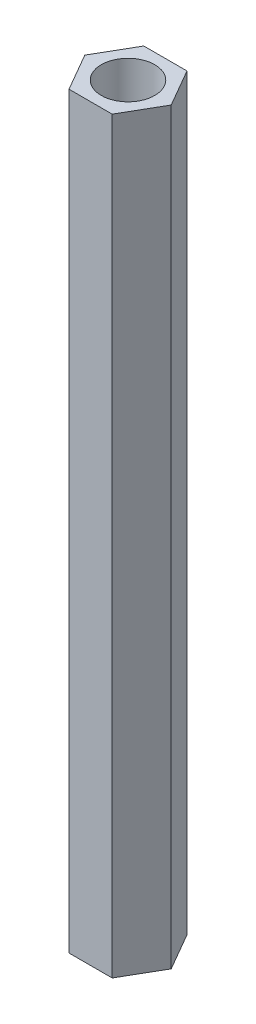
ISO-10303-21;
HEADER;
FILE_DESCRIPTION(('STEP AP214'),'2;1');
FILE_NAME('part.step','',(''),(''),'','','');
FILE_SCHEMA(('AUTOMOTIVE_DESIGN { 1 0 10303 214 1 1 1 1 }'));
ENDSEC;
DATA;
#1=APPLICATION_CONTEXT('core data for automotive mechanical design processes');
#2=APPLICATION_PROTOCOL_DEFINITION('international standard','automotive_design',2000,#1);
#3=PRODUCT_CONTEXT('',#1,'mechanical');
#4=PRODUCT('Part','Part','',(#3));
#5=PRODUCT_RELATED_PRODUCT_CATEGORY('part','',(#4));
#6=PRODUCT_DEFINITION_FORMATION('','',#4);
#7=PRODUCT_DEFINITION_CONTEXT('part definition',#1,'design');
#8=PRODUCT_DEFINITION('design','',#6,#7);
#9=PRODUCT_DEFINITION_SHAPE('','',#8);
#10=(LENGTH_UNIT() NAMED_UNIT(*) SI_UNIT(.MILLI.,.METRE.));
#11=(NAMED_UNIT(*) PLANE_ANGLE_UNIT() SI_UNIT($,.RADIAN.));
#12=(NAMED_UNIT(*) SI_UNIT($,.STERADIAN.) SOLID_ANGLE_UNIT());
#13=UNCERTAINTY_MEASURE_WITH_UNIT(LENGTH_MEASURE(1.E-05),#10,'distance_accuracy_value','');
#14=(GEOMETRIC_REPRESENTATION_CONTEXT(3) GLOBAL_UNCERTAINTY_ASSIGNED_CONTEXT((#13)) GLOBAL_UNIT_ASSIGNED_CONTEXT((#10,
#11,#12)) REPRESENTATION_CONTEXT('',''));
#15=CARTESIAN_POINT('',(0.,0.,0.));
#16=DIRECTION('',(0.,0.,1.));
#17=DIRECTION('',(1.,0.,0.));
#18=AXIS2_PLACEMENT_3D('',#15,#16,#17);
#19=CARTESIAN_POINT('',(0.,70.,0.));
#20=DIRECTION('',(0.,1.,0.));
#21=DIRECTION('',(0.,0.,1.));
#22=AXIS2_PLACEMENT_3D('',#19,#20,#21);
#23=PLANE('',#22);
#24=DIRECTION('',(1.,0.,0.));
#25=VECTOR('',#24,1.);
#26=CARTESIAN_POINT('',(-2.02072594216369,70.,3.5));
#27=LINE('',#26,#25);
#28=CARTESIAN_POINT('',(-2.02072594216369,70.,3.5));
#29=VERTEX_POINT('',#28);
#30=CARTESIAN_POINT('',(2.02072594216369,70.,3.5));
#31=VERTEX_POINT('',#30);
#32=EDGE_CURVE('E152',#29,#31,#27,.T.);
#33=ORIENTED_EDGE('',*,*,#32,.T.);
#34=DIRECTION('',(0.5,0.,-0.866025403784439));
#35=VECTOR('',#34,1.);
#36=CARTESIAN_POINT('',(2.02072594216369,70.,3.5));
#37=LINE('',#36,#35);
#38=CARTESIAN_POINT('',(4.04145188432738,70.,0.));
#39=VERTEX_POINT('',#38);
#40=EDGE_CURVE('E100',#31,#39,#37,.T.);
#41=ORIENTED_EDGE('',*,*,#40,.T.);
#42=DIRECTION('',(-0.5,0.,-0.866025403784439));
#43=VECTOR('',#42,1.);
#44=CARTESIAN_POINT('',(4.04145188432738,70.,0.));
#45=LINE('',#44,#43);
#46=CARTESIAN_POINT('',(2.02072594216369,70.,-3.5));
#47=VERTEX_POINT('',#46);
#48=EDGE_CURVE('E113',#39,#47,#45,.T.);
#49=ORIENTED_EDGE('',*,*,#48,.T.);
#50=DIRECTION('',(-1.,0.,0.));
#51=VECTOR('',#50,1.);
#52=CARTESIAN_POINT('',(2.02072594216369,70.,-3.5));
#53=LINE('',#52,#51);
#54=CARTESIAN_POINT('',(-2.02072594216369,70.,-3.5));
#55=VERTEX_POINT('',#54);
#56=EDGE_CURVE('E107',#47,#55,#53,.T.);
#57=ORIENTED_EDGE('',*,*,#56,.T.);
#58=DIRECTION('',(-0.5,0.,0.866025403784439));
#59=VECTOR('',#58,1.);
#60=CARTESIAN_POINT('',(-2.02072594216369,70.,-3.5));
#61=LINE('',#60,#59);
#62=CARTESIAN_POINT('',(-4.04145188432738,70.,0.));
#63=VERTEX_POINT('',#62);
#64=EDGE_CURVE('E111',#55,#63,#61,.T.);
#65=ORIENTED_EDGE('',*,*,#64,.T.);
#66=DIRECTION('',(0.5,0.,0.866025403784439));
#67=VECTOR('',#66,1.);
#68=CARTESIAN_POINT('',(-4.04145188432738,70.,0.));
#69=LINE('',#68,#67);
#70=EDGE_CURVE('E63',#63,#29,#69,.T.);
#71=ORIENTED_EDGE('',*,*,#70,.T.);
#72=EDGE_LOOP('',(#33,#41,#49,#57,#65,#71));
#73=FACE_BOUND('',#72,.T.);
#74=CARTESIAN_POINT('',(0.,70.,0.));
#75=DIRECTION('',(0.,1.,0.));
#76=DIRECTION('',(0.,0.,1.));
#77=AXIS2_PLACEMENT_3D('',#74,#75,#76);
#78=CIRCLE('',#77,2.5);
#79=CARTESIAN_POINT('',(0.,70.,2.5));
#80=VERTEX_POINT('',#79);
#81=EDGE_CURVE('E140',#80,#80,#78,.T.);
#82=ORIENTED_EDGE('',*,*,#81,.F.);
#83=EDGE_LOOP('',(#82));
#84=FACE_BOUND('',#83,.T.);
#85=ADVANCED_FACE('F45',(#73,#84),#23,.T.);
#86=CARTESIAN_POINT('',(0.,0.,0.));
#87=DIRECTION('',(0.,1.,0.));
#88=DIRECTION('',(0.,0.,1.));
#89=AXIS2_PLACEMENT_3D('',#86,#87,#88);
#90=PLANE('',#89);
#91=DIRECTION('',(1.,0.,0.));
#92=VECTOR('',#91,1.);
#93=CARTESIAN_POINT('',(-2.02072594216369,0.,3.5));
#94=LINE('',#93,#92);
#95=CARTESIAN_POINT('',(-2.02072594216369,0.,3.5));
#96=VERTEX_POINT('',#95);
#97=CARTESIAN_POINT('',(2.02072594216369,0.,3.5));
#98=VERTEX_POINT('',#97);
#99=EDGE_CURVE('E135',#96,#98,#94,.T.);
#100=ORIENTED_EDGE('',*,*,#99,.F.);
#101=DIRECTION('',(0.5,0.,0.866025403784439));
#102=VECTOR('',#101,1.);
#103=CARTESIAN_POINT('',(-4.04145188432738,0.,0.));
#104=LINE('',#103,#102);
#105=CARTESIAN_POINT('',(-4.04145188432738,0.,0.));
#106=VERTEX_POINT('',#105);
#107=EDGE_CURVE('E92',#106,#96,#104,.T.);
#108=ORIENTED_EDGE('',*,*,#107,.F.);
#109=DIRECTION('',(-0.5,0.,0.866025403784439));
#110=VECTOR('',#109,1.);
#111=CARTESIAN_POINT('',(-2.02072594216369,0.,-3.5));
#112=LINE('',#111,#110);
#113=CARTESIAN_POINT('',(-2.02072594216369,0.,-3.5));
#114=VERTEX_POINT('',#113);
#115=EDGE_CURVE('E86',#114,#106,#112,.T.);
#116=ORIENTED_EDGE('',*,*,#115,.F.);
#117=DIRECTION('',(-1.,0.,0.));
#118=VECTOR('',#117,1.);
#119=CARTESIAN_POINT('',(2.02072594216369,0.,-3.5));
#120=LINE('',#119,#118);
#121=CARTESIAN_POINT('',(2.02072594216369,0.,-3.5));
#122=VERTEX_POINT('',#121);
#123=EDGE_CURVE('E122',#122,#114,#120,.T.);
#124=ORIENTED_EDGE('',*,*,#123,.F.);
#125=DIRECTION('',(-0.5,0.,-0.866025403784439));
#126=VECTOR('',#125,1.);
#127=CARTESIAN_POINT('',(4.04145188432738,0.,0.));
#128=LINE('',#127,#126);
#129=CARTESIAN_POINT('',(4.04145188432738,0.,0.));
#130=VERTEX_POINT('',#129);
#131=EDGE_CURVE('E143',#130,#122,#128,.T.);
#132=ORIENTED_EDGE('',*,*,#131,.F.);
#133=DIRECTION('',(0.5,0.,-0.866025403784439));
#134=VECTOR('',#133,1.);
#135=CARTESIAN_POINT('',(2.02072594216369,0.,3.5));
#136=LINE('',#135,#134);
#137=EDGE_CURVE('E139',#98,#130,#136,.T.);
#138=ORIENTED_EDGE('',*,*,#137,.F.);
#139=EDGE_LOOP('',(#100,#108,#116,#124,#132,#138));
#140=FACE_BOUND('',#139,.T.);
#141=CARTESIAN_POINT('',(0.,0.,0.));
#142=DIRECTION('',(0.,1.,0.));
#143=DIRECTION('',(0.,0.,1.));
#144=AXIS2_PLACEMENT_3D('',#141,#142,#143);
#145=CIRCLE('',#144,2.5);
#146=CARTESIAN_POINT('',(0.,0.,2.5));
#147=VERTEX_POINT('',#146);
#148=EDGE_CURVE('E249',#147,#147,#145,.T.);
#149=ORIENTED_EDGE('',*,*,#148,.T.);
#150=EDGE_LOOP('',(#149));
#151=FACE_BOUND('',#150,.T.);
#152=ADVANCED_FACE('F165',(#140,#151),#90,.F.);
#153=CARTESIAN_POINT('',(-2.02072594216369,70.,3.5));
#154=DIRECTION('',(0.,0.,-1.));
#155=DIRECTION('',(-1.,0.,0.));
#156=AXIS2_PLACEMENT_3D('',#153,#154,#155);
#157=PLANE('',#156);
#158=ORIENTED_EDGE('',*,*,#99,.T.);
#159=DIRECTION('',(0.,-1.,0.));
#160=VECTOR('',#159,1.);
#161=CARTESIAN_POINT('',(2.02072594216369,70.,3.5));
#162=LINE('',#161,#160);
#163=EDGE_CURVE('E11',#31,#98,#162,.T.);
#164=ORIENTED_EDGE('',*,*,#163,.F.);
#165=ORIENTED_EDGE('',*,*,#32,.F.);
#166=DIRECTION('',(0.,-1.,0.));
#167=VECTOR('',#166,1.);
#168=CARTESIAN_POINT('',(-2.02072594216369,70.,3.5));
#169=LINE('',#168,#167);
#170=EDGE_CURVE('E131',#29,#96,#169,.T.);
#171=ORIENTED_EDGE('',*,*,#170,.T.);
#172=EDGE_LOOP('',(#158,#164,#165,#171));
#173=FACE_BOUND('',#172,.T.);
#174=ADVANCED_FACE('F47',(#173),#157,.F.);
#175=CARTESIAN_POINT('',(2.02072594216369,70.,3.5));
#176=DIRECTION('',(-0.866025403784439,0.,-0.5));
#177=DIRECTION('',(-0.5,0.,0.866025403784439));
#178=AXIS2_PLACEMENT_3D('',#175,#176,#177);
#179=PLANE('',#178);
#180=ORIENTED_EDGE('',*,*,#137,.T.);
#181=DIRECTION('',(0.,-1.,0.));
#182=VECTOR('',#181,1.);
#183=CARTESIAN_POINT('',(4.04145188432738,70.,0.));
#184=LINE('',#183,#182);
#185=EDGE_CURVE('E55',#39,#130,#184,.T.);
#186=ORIENTED_EDGE('',*,*,#185,.F.);
#187=ORIENTED_EDGE('',*,*,#40,.F.);
#188=ORIENTED_EDGE('',*,*,#163,.T.);
#189=EDGE_LOOP('',(#180,#186,#187,#188));
#190=FACE_BOUND('',#189,.T.);
#191=ADVANCED_FACE('F190',(#190),#179,.F.);
#192=CARTESIAN_POINT('',(4.04145188432738,70.,0.));
#193=DIRECTION('',(-0.866025403784439,0.,0.5));
#194=DIRECTION('',(0.5,0.,0.866025403784439));
#195=AXIS2_PLACEMENT_3D('',#192,#193,#194);
#196=PLANE('',#195);
#197=ORIENTED_EDGE('',*,*,#131,.T.);
#198=DIRECTION('',(0.,-1.,0.));
#199=VECTOR('',#198,1.);
#200=CARTESIAN_POINT('',(2.02072594216369,70.,-3.5));
#201=LINE('',#200,#199);
#202=EDGE_CURVE('E124',#47,#122,#201,.T.);
#203=ORIENTED_EDGE('',*,*,#202,.F.);
#204=ORIENTED_EDGE('',*,*,#48,.F.);
#205=ORIENTED_EDGE('',*,*,#185,.T.);
#206=EDGE_LOOP('',(#197,#203,#204,#205));
#207=FACE_BOUND('',#206,.T.);
#208=ADVANCED_FACE('F162',(#207),#196,.F.);
#209=CARTESIAN_POINT('',(2.02072594216369,70.,-3.5));
#210=DIRECTION('',(0.,0.,1.));
#211=DIRECTION('',(1.,0.,0.));
#212=AXIS2_PLACEMENT_3D('',#209,#210,#211);
#213=PLANE('',#212);
#214=ORIENTED_EDGE('',*,*,#123,.T.);
#215=DIRECTION('',(0.,-1.,0.));
#216=VECTOR('',#215,1.);
#217=CARTESIAN_POINT('',(-2.02072594216369,70.,-3.5));
#218=LINE('',#217,#216);
#219=EDGE_CURVE('E119',#55,#114,#218,.T.);
#220=ORIENTED_EDGE('',*,*,#219,.F.);
#221=ORIENTED_EDGE('',*,*,#56,.F.);
#222=ORIENTED_EDGE('',*,*,#202,.T.);
#223=EDGE_LOOP('',(#214,#220,#221,#222));
#224=FACE_BOUND('',#223,.T.);
#225=ADVANCED_FACE('F120',(#224),#213,.F.);
#226=CARTESIAN_POINT('',(-2.02072594216369,70.,-3.5));
#227=DIRECTION('',(0.866025403784439,0.,0.5));
#228=DIRECTION('',(0.5,0.,-0.866025403784439));
#229=AXIS2_PLACEMENT_3D('',#226,#227,#228);
#230=PLANE('',#229);
#231=ORIENTED_EDGE('',*,*,#115,.T.);
#232=DIRECTION('',(0.,-1.,0.));
#233=VECTOR('',#232,1.);
#234=CARTESIAN_POINT('',(-4.04145188432738,70.,0.));
#235=LINE('',#234,#233);
#236=EDGE_CURVE('E125',#63,#106,#235,.T.);
#237=ORIENTED_EDGE('',*,*,#236,.F.);
#238=ORIENTED_EDGE('',*,*,#64,.F.);
#239=ORIENTED_EDGE('',*,*,#219,.T.);
#240=EDGE_LOOP('',(#231,#237,#238,#239));
#241=FACE_BOUND('',#240,.T.);
#242=ADVANCED_FACE('F127',(#241),#230,.F.);
#243=CARTESIAN_POINT('',(-4.04145188432738,70.,0.));
#244=DIRECTION('',(0.866025403784439,0.,-0.5));
#245=DIRECTION('',(-0.5,0.,-0.866025403784439));
#246=AXIS2_PLACEMENT_3D('',#243,#244,#245);
#247=PLANE('',#246);
#248=ORIENTED_EDGE('',*,*,#107,.T.);
#249=ORIENTED_EDGE('',*,*,#170,.F.);
#250=ORIENTED_EDGE('',*,*,#70,.F.);
#251=ORIENTED_EDGE('',*,*,#236,.T.);
#252=EDGE_LOOP('',(#248,#249,#250,#251));
#253=FACE_BOUND('',#252,.T.);
#254=ADVANCED_FACE('F170',(#253),#247,.F.);
#255=CARTESIAN_POINT('',(0.,70.,0.));
#256=DIRECTION('',(0.,-1.,0.));
#257=DIRECTION('',(0.,0.,-1.));
#258=AXIS2_PLACEMENT_3D('',#255,#256,#257);
#259=CYLINDRICAL_SURFACE('',#258,2.5);
#260=ORIENTED_EDGE('',*,*,#81,.T.);
#261=EDGE_LOOP('',(#260));
#262=FACE_BOUND('',#261,.T.);
#263=ORIENTED_EDGE('',*,*,#148,.F.);
#264=EDGE_LOOP('',(#263));
#265=FACE_BOUND('',#264,.T.);
#266=ADVANCED_FACE('F172',(#262,#265),#259,.F.);
#267=CLOSED_SHELL('',(#85,#152,#174,#191,#208,#225,#242,#254,#266));
#268=MANIFOLD_SOLID_BREP('B2',#267);
#269=ADVANCED_BREP_SHAPE_REPRESENTATION('',(#18,#268),#14);
#270=SHAPE_DEFINITION_REPRESENTATION(#9,#269);
ENDSEC;
END-ISO-10303-21;
